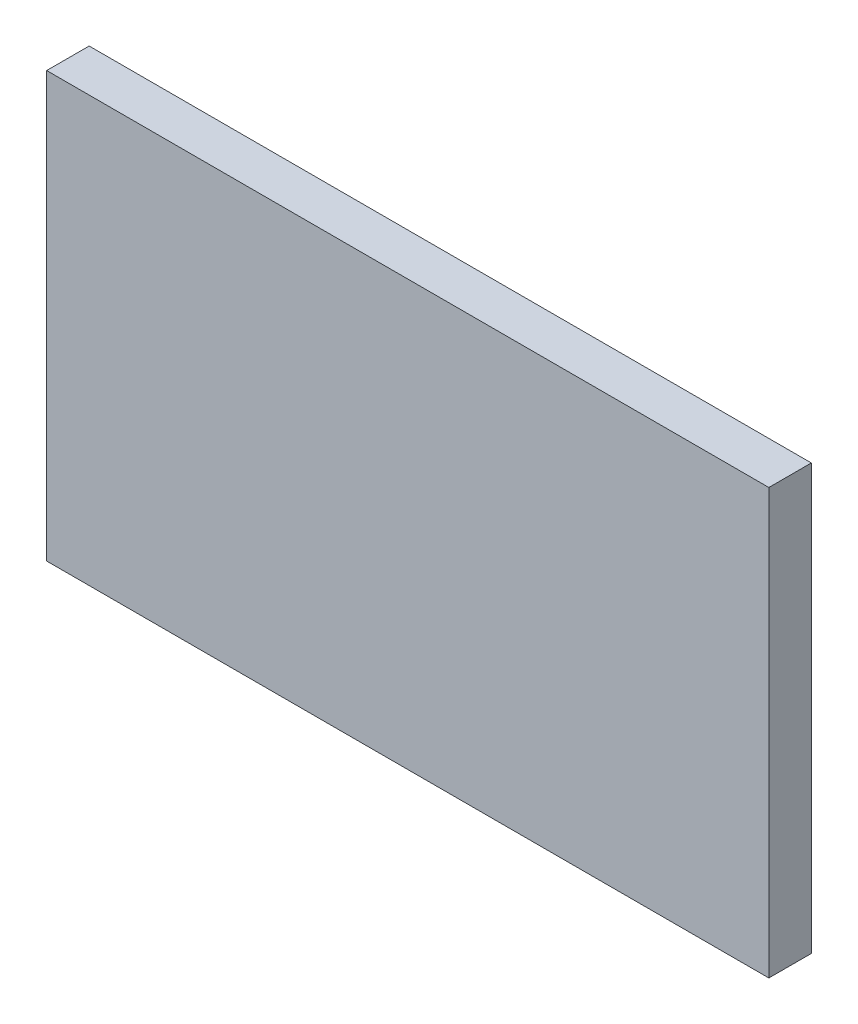
ISO-10303-21;
HEADER;
FILE_DESCRIPTION(('STEP AP214'),'2;1');
FILE_NAME('part.step','',(''),(''),'','','');
FILE_SCHEMA(('AUTOMOTIVE_DESIGN { 1 0 10303 214 1 1 1 1 }'));
ENDSEC;
DATA;
#1=APPLICATION_CONTEXT('core data for automotive mechanical design processes');
#2=APPLICATION_PROTOCOL_DEFINITION('international standard','automotive_design',2000,#1);
#3=PRODUCT_CONTEXT('',#1,'mechanical');
#4=PRODUCT('Part','Part','',(#3));
#5=PRODUCT_RELATED_PRODUCT_CATEGORY('part','',(#4));
#6=PRODUCT_DEFINITION_FORMATION('','',#4);
#7=PRODUCT_DEFINITION_CONTEXT('part definition',#1,'design');
#8=PRODUCT_DEFINITION('design','',#6,#7);
#9=PRODUCT_DEFINITION_SHAPE('','',#8);
#10=(LENGTH_UNIT() NAMED_UNIT(*) SI_UNIT(.MILLI.,.METRE.));
#11=(NAMED_UNIT(*) PLANE_ANGLE_UNIT() SI_UNIT($,.RADIAN.));
#12=(NAMED_UNIT(*) SI_UNIT($,.STERADIAN.) SOLID_ANGLE_UNIT());
#13=UNCERTAINTY_MEASURE_WITH_UNIT(LENGTH_MEASURE(1.E-05),#10,'distance_accuracy_value','');
#14=(GEOMETRIC_REPRESENTATION_CONTEXT(3) GLOBAL_UNCERTAINTY_ASSIGNED_CONTEXT((#13)) GLOBAL_UNIT_ASSIGNED_CONTEXT((#10,
#11,#12)) REPRESENTATION_CONTEXT('',''));
#15=CARTESIAN_POINT('',(0.,0.,0.));
#16=DIRECTION('',(0.,0.,1.));
#17=DIRECTION('',(1.,0.,0.));
#18=AXIS2_PLACEMENT_3D('',#15,#16,#17);
#19=CARTESIAN_POINT('',(0.,0.,6.));
#20=DIRECTION('',(-1.,0.,0.));
#21=DIRECTION('',(0.,0.,1.));
#22=AXIS2_PLACEMENT_3D('',#19,#20,#21);
#23=PLANE('',#22);
#24=DIRECTION('',(0.,1.,0.));
#25=VECTOR('',#24,1.);
#26=CARTESIAN_POINT('',(0.,0.,0.));
#27=LINE('',#26,#25);
#28=CARTESIAN_POINT('',(0.,0.,0.));
#29=VERTEX_POINT('',#28);
#30=CARTESIAN_POINT('',(0.,60.,0.));
#31=VERTEX_POINT('',#30);
#32=EDGE_CURVE('E95',#29,#31,#27,.T.);
#33=ORIENTED_EDGE('',*,*,#32,.T.);
#34=DIRECTION('',(0.,0.,-1.));
#35=VECTOR('',#34,1.);
#36=CARTESIAN_POINT('',(0.,60.,6.));
#37=LINE('',#36,#35);
#38=CARTESIAN_POINT('',(0.,60.,6.));
#39=VERTEX_POINT('',#38);
#40=EDGE_CURVE('E11',#39,#31,#37,.T.);
#41=ORIENTED_EDGE('',*,*,#40,.F.);
#42=DIRECTION('',(0.,1.,0.));
#43=VECTOR('',#42,1.);
#44=CARTESIAN_POINT('',(0.,0.,6.));
#45=LINE('',#44,#43);
#46=CARTESIAN_POINT('',(0.,0.,6.));
#47=VERTEX_POINT('',#46);
#48=EDGE_CURVE('E83',#47,#39,#45,.T.);
#49=ORIENTED_EDGE('',*,*,#48,.F.);
#50=DIRECTION('',(0.,0.,-1.));
#51=VECTOR('',#50,1.);
#52=CARTESIAN_POINT('',(0.,0.,6.));
#53=LINE('',#52,#51);
#54=EDGE_CURVE('E91',#47,#29,#53,.T.);
#55=ORIENTED_EDGE('',*,*,#54,.T.);
#56=EDGE_LOOP('',(#33,#41,#49,#55));
#57=FACE_BOUND('',#56,.T.);
#58=ADVANCED_FACE('F32',(#57),#23,.F.);
#59=CARTESIAN_POINT('',(0.,60.,6.));
#60=DIRECTION('',(0.,-1.,0.));
#61=DIRECTION('',(1.,0.,0.));
#62=AXIS2_PLACEMENT_3D('',#59,#60,#61);
#63=PLANE('',#62);
#64=DIRECTION('',(-1.,0.,0.));
#65=VECTOR('',#64,1.);
#66=CARTESIAN_POINT('',(0.,60.,0.));
#67=LINE('',#66,#65);
#68=CARTESIAN_POINT('',(-102.,60.,0.));
#69=VERTEX_POINT('',#68);
#70=EDGE_CURVE('E87',#31,#69,#67,.T.);
#71=ORIENTED_EDGE('',*,*,#70,.T.);
#72=DIRECTION('',(0.,0.,-1.));
#73=VECTOR('',#72,1.);
#74=CARTESIAN_POINT('',(-102.,60.,6.));
#75=LINE('',#74,#73);
#76=CARTESIAN_POINT('',(-102.,60.,6.));
#77=VERTEX_POINT('',#76);
#78=EDGE_CURVE('E40',#77,#69,#75,.T.);
#79=ORIENTED_EDGE('',*,*,#78,.F.);
#80=DIRECTION('',(-1.,0.,0.));
#81=VECTOR('',#80,1.);
#82=CARTESIAN_POINT('',(0.,60.,6.));
#83=LINE('',#82,#81);
#84=EDGE_CURVE('E78',#39,#77,#83,.T.);
#85=ORIENTED_EDGE('',*,*,#84,.F.);
#86=ORIENTED_EDGE('',*,*,#40,.T.);
#87=EDGE_LOOP('',(#71,#79,#85,#86));
#88=FACE_BOUND('',#87,.T.);
#89=ADVANCED_FACE('F86',(#88),#63,.F.);
#90=CARTESIAN_POINT('',(-102.,0.,6.));
#91=DIRECTION('',(1.,0.,0.));
#92=DIRECTION('',(0.,0.,-1.));
#93=AXIS2_PLACEMENT_3D('',#90,#91,#92);
#94=PLANE('',#93);
#95=DIRECTION('',(0.,-1.,0.));
#96=VECTOR('',#95,1.);
#97=CARTESIAN_POINT('',(-102.,0.,0.));
#98=LINE('',#97,#96);
#99=CARTESIAN_POINT('',(-102.,0.,0.));
#100=VERTEX_POINT('',#99);
#101=EDGE_CURVE('E65',#69,#100,#98,.T.);
#102=ORIENTED_EDGE('',*,*,#101,.T.);
#103=DIRECTION('',(0.,0.,-1.));
#104=VECTOR('',#103,1.);
#105=CARTESIAN_POINT('',(-102.,0.,6.));
#106=LINE('',#105,#104);
#107=CARTESIAN_POINT('',(-102.,0.,6.));
#108=VERTEX_POINT('',#107);
#109=EDGE_CURVE('E88',#108,#100,#106,.T.);
#110=ORIENTED_EDGE('',*,*,#109,.F.);
#111=DIRECTION('',(0.,-1.,0.));
#112=VECTOR('',#111,1.);
#113=CARTESIAN_POINT('',(-102.,0.,6.));
#114=LINE('',#113,#112);
#115=EDGE_CURVE('E81',#77,#108,#114,.T.);
#116=ORIENTED_EDGE('',*,*,#115,.F.);
#117=ORIENTED_EDGE('',*,*,#78,.T.);
#118=EDGE_LOOP('',(#102,#110,#116,#117));
#119=FACE_BOUND('',#118,.T.);
#120=ADVANCED_FACE('F89',(#119),#94,.F.);
#121=CARTESIAN_POINT('',(0.,0.,6.));
#122=DIRECTION('',(0.,1.,0.));
#123=DIRECTION('',(-1.,0.,0.));
#124=AXIS2_PLACEMENT_3D('',#121,#122,#123);
#125=PLANE('',#124);
#126=DIRECTION('',(1.,0.,0.));
#127=VECTOR('',#126,1.);
#128=CARTESIAN_POINT('',(0.,0.,0.));
#129=LINE('',#128,#127);
#130=EDGE_CURVE('E71',#100,#29,#129,.T.);
#131=ORIENTED_EDGE('',*,*,#130,.T.);
#132=ORIENTED_EDGE('',*,*,#54,.F.);
#133=DIRECTION('',(1.,0.,0.));
#134=VECTOR('',#133,1.);
#135=CARTESIAN_POINT('',(0.,0.,6.));
#136=LINE('',#135,#134);
#137=EDGE_CURVE('E48',#108,#47,#136,.T.);
#138=ORIENTED_EDGE('',*,*,#137,.F.);
#139=ORIENTED_EDGE('',*,*,#109,.T.);
#140=EDGE_LOOP('',(#131,#132,#138,#139));
#141=FACE_BOUND('',#140,.T.);
#142=ADVANCED_FACE('F102',(#141),#125,.F.);
#143=CARTESIAN_POINT('',(0.,0.,6.));
#144=DIRECTION('',(0.,0.,1.));
#145=DIRECTION('',(1.,0.,0.));
#146=AXIS2_PLACEMENT_3D('',#143,#144,#145);
#147=PLANE('',#146);
#148=ORIENTED_EDGE('',*,*,#48,.T.);
#149=ORIENTED_EDGE('',*,*,#84,.T.);
#150=ORIENTED_EDGE('',*,*,#115,.T.);
#151=ORIENTED_EDGE('',*,*,#137,.T.);
#152=EDGE_LOOP('',(#148,#149,#150,#151));
#153=FACE_BOUND('',#152,.T.);
#154=ADVANCED_FACE('F79',(#153),#147,.T.);
#155=CARTESIAN_POINT('',(0.,0.,0.));
#156=DIRECTION('',(0.,0.,1.));
#157=DIRECTION('',(1.,0.,0.));
#158=AXIS2_PLACEMENT_3D('',#155,#156,#157);
#159=PLANE('',#158);
#160=ORIENTED_EDGE('',*,*,#32,.F.);
#161=ORIENTED_EDGE('',*,*,#130,.F.);
#162=ORIENTED_EDGE('',*,*,#101,.F.);
#163=ORIENTED_EDGE('',*,*,#70,.F.);
#164=EDGE_LOOP('',(#160,#161,#162,#163));
#165=FACE_BOUND('',#164,.T.);
#166=ADVANCED_FACE('F105',(#165),#159,.F.);
#167=CLOSED_SHELL('',(#58,#89,#120,#142,#154,#166));
#168=MANIFOLD_SOLID_BREP('B2',#167);
#169=ADVANCED_BREP_SHAPE_REPRESENTATION('',(#18,#168),#14);
#170=SHAPE_DEFINITION_REPRESENTATION(#9,#169);
ENDSEC;
END-ISO-10303-21;
